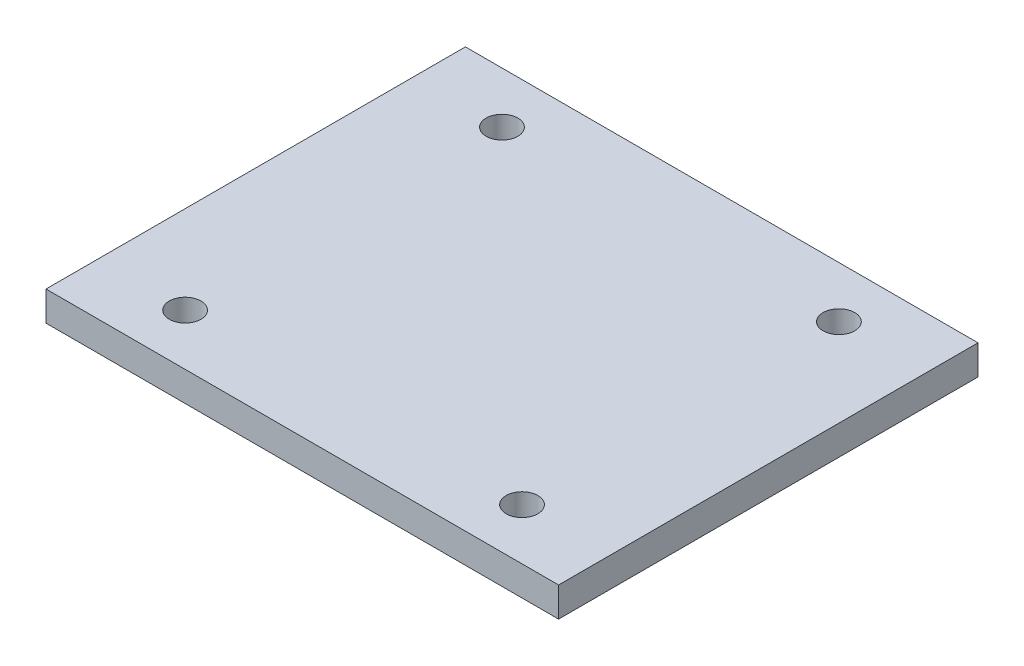
ISO-10303-21;
HEADER;
FILE_DESCRIPTION(('STEP AP214'),'2;1');
FILE_NAME('part.step','',(''),(''),'','','');
FILE_SCHEMA(('AUTOMOTIVE_DESIGN { 1 0 10303 214 1 1 1 1 }'));
ENDSEC;
DATA;
#1=APPLICATION_CONTEXT('core data for automotive mechanical design processes');
#2=APPLICATION_PROTOCOL_DEFINITION('international standard','automotive_design',2000,#1);
#3=PRODUCT_CONTEXT('',#1,'mechanical');
#4=PRODUCT('Part','Part','',(#3));
#5=PRODUCT_RELATED_PRODUCT_CATEGORY('part','',(#4));
#6=PRODUCT_DEFINITION_FORMATION('','',#4);
#7=PRODUCT_DEFINITION_CONTEXT('part definition',#1,'design');
#8=PRODUCT_DEFINITION('design','',#6,#7);
#9=PRODUCT_DEFINITION_SHAPE('','',#8);
#10=(LENGTH_UNIT() NAMED_UNIT(*) SI_UNIT(.MILLI.,.METRE.));
#11=(NAMED_UNIT(*) PLANE_ANGLE_UNIT() SI_UNIT($,.RADIAN.));
#12=(NAMED_UNIT(*) SI_UNIT($,.STERADIAN.) SOLID_ANGLE_UNIT());
#13=UNCERTAINTY_MEASURE_WITH_UNIT(LENGTH_MEASURE(1.E-05),#10,'distance_accuracy_value','');
#14=(GEOMETRIC_REPRESENTATION_CONTEXT(3) GLOBAL_UNCERTAINTY_ASSIGNED_CONTEXT((#13)) GLOBAL_UNIT_ASSIGNED_CONTEXT((#10,
#11,#12)) REPRESENTATION_CONTEXT('',''));
#15=CARTESIAN_POINT('',(0.,0.,0.));
#16=DIRECTION('',(0.,0.,1.));
#17=DIRECTION('',(1.,0.,0.));
#18=AXIS2_PLACEMENT_3D('',#15,#16,#17);
#19=CARTESIAN_POINT('',(110.,6.35,0.));
#20=DIRECTION('',(0.,0.,-1.));
#21=DIRECTION('',(-1.,0.,0.));
#22=AXIS2_PLACEMENT_3D('',#19,#20,#21);
#23=PLANE('',#22);
#24=DIRECTION('',(1.,0.,0.));
#25=VECTOR('',#24,1.);
#26=CARTESIAN_POINT('',(110.,0.,0.));
#27=LINE('',#26,#25);
#28=CARTESIAN_POINT('',(0.,0.,0.));
#29=VERTEX_POINT('',#28);
#30=CARTESIAN_POINT('',(110.,0.,0.));
#31=VERTEX_POINT('',#30);
#32=EDGE_CURVE('E100',#29,#31,#27,.T.);
#33=ORIENTED_EDGE('',*,*,#32,.T.);
#34=DIRECTION('',(0.,-1.,0.));
#35=VECTOR('',#34,1.);
#36=CARTESIAN_POINT('',(110.,6.35,0.));
#37=LINE('',#36,#35);
#38=CARTESIAN_POINT('',(110.,6.35,0.));
#39=VERTEX_POINT('',#38);
#40=EDGE_CURVE('E11',#39,#31,#37,.T.);
#41=ORIENTED_EDGE('',*,*,#40,.F.);
#42=DIRECTION('',(1.,0.,0.));
#43=VECTOR('',#42,1.);
#44=CARTESIAN_POINT('',(110.,6.35,0.));
#45=LINE('',#44,#43);
#46=CARTESIAN_POINT('',(0.,6.35,0.));
#47=VERTEX_POINT('',#46);
#48=EDGE_CURVE('E88',#47,#39,#45,.T.);
#49=ORIENTED_EDGE('',*,*,#48,.F.);
#50=DIRECTION('',(0.,-1.,0.));
#51=VECTOR('',#50,1.);
#52=CARTESIAN_POINT('',(0.,6.35,0.));
#53=LINE('',#52,#51);
#54=EDGE_CURVE('E96',#47,#29,#53,.T.);
#55=ORIENTED_EDGE('',*,*,#54,.T.);
#56=EDGE_LOOP('',(#33,#41,#49,#55));
#57=FACE_BOUND('',#56,.T.);
#58=ADVANCED_FACE('F37',(#57),#23,.F.);
#59=CARTESIAN_POINT('',(110.,6.35,-90.));
#60=DIRECTION('',(-1.,0.,0.));
#61=DIRECTION('',(0.,0.,1.));
#62=AXIS2_PLACEMENT_3D('',#59,#60,#61);
#63=PLANE('',#62);
#64=DIRECTION('',(0.,0.,-1.));
#65=VECTOR('',#64,1.);
#66=CARTESIAN_POINT('',(110.,0.,-90.));
#67=LINE('',#66,#65);
#68=CARTESIAN_POINT('',(110.,0.,-90.));
#69=VERTEX_POINT('',#68);
#70=EDGE_CURVE('E92',#31,#69,#67,.T.);
#71=ORIENTED_EDGE('',*,*,#70,.T.);
#72=DIRECTION('',(0.,-1.,0.));
#73=VECTOR('',#72,1.);
#74=CARTESIAN_POINT('',(110.,6.35,-90.));
#75=LINE('',#74,#73);
#76=CARTESIAN_POINT('',(110.,6.35,-90.));
#77=VERTEX_POINT('',#76);
#78=EDGE_CURVE('E45',#77,#69,#75,.T.);
#79=ORIENTED_EDGE('',*,*,#78,.F.);
#80=DIRECTION('',(0.,0.,-1.));
#81=VECTOR('',#80,1.);
#82=CARTESIAN_POINT('',(110.,6.35,-90.));
#83=LINE('',#82,#81);
#84=EDGE_CURVE('E83',#39,#77,#83,.T.);
#85=ORIENTED_EDGE('',*,*,#84,.F.);
#86=ORIENTED_EDGE('',*,*,#40,.T.);
#87=EDGE_LOOP('',(#71,#79,#85,#86));
#88=FACE_BOUND('',#87,.T.);
#89=ADVANCED_FACE('F91',(#88),#63,.F.);
#90=CARTESIAN_POINT('',(0.,6.35,-90.));
#91=DIRECTION('',(0.,0.,1.));
#92=DIRECTION('',(1.,0.,0.));
#93=AXIS2_PLACEMENT_3D('',#90,#91,#92);
#94=PLANE('',#93);
#95=DIRECTION('',(-1.,0.,0.));
#96=VECTOR('',#95,1.);
#97=CARTESIAN_POINT('',(0.,0.,-90.));
#98=LINE('',#97,#96);
#99=CARTESIAN_POINT('',(0.,0.,-90.));
#100=VERTEX_POINT('',#99);
#101=EDGE_CURVE('E70',#69,#100,#98,.T.);
#102=ORIENTED_EDGE('',*,*,#101,.T.);
#103=DIRECTION('',(0.,-1.,0.));
#104=VECTOR('',#103,1.);
#105=CARTESIAN_POINT('',(0.,6.35,-90.));
#106=LINE('',#105,#104);
#107=CARTESIAN_POINT('',(0.,6.35,-90.));
#108=VERTEX_POINT('',#107);
#109=EDGE_CURVE('E93',#108,#100,#106,.T.);
#110=ORIENTED_EDGE('',*,*,#109,.F.);
#111=DIRECTION('',(-1.,0.,0.));
#112=VECTOR('',#111,1.);
#113=CARTESIAN_POINT('',(0.,6.35,-90.));
#114=LINE('',#113,#112);
#115=EDGE_CURVE('E86',#77,#108,#114,.T.);
#116=ORIENTED_EDGE('',*,*,#115,.F.);
#117=ORIENTED_EDGE('',*,*,#78,.T.);
#118=EDGE_LOOP('',(#102,#110,#116,#117));
#119=FACE_BOUND('',#118,.T.);
#120=ADVANCED_FACE('F94',(#119),#94,.F.);
#121=CARTESIAN_POINT('',(0.,6.35,0.));
#122=DIRECTION('',(1.,0.,0.));
#123=DIRECTION('',(0.,0.,-1.));
#124=AXIS2_PLACEMENT_3D('',#121,#122,#123);
#125=PLANE('',#124);
#126=DIRECTION('',(0.,0.,1.));
#127=VECTOR('',#126,1.);
#128=CARTESIAN_POINT('',(0.,0.,0.));
#129=LINE('',#128,#127);
#130=EDGE_CURVE('E76',#100,#29,#129,.T.);
#131=ORIENTED_EDGE('',*,*,#130,.T.);
#132=ORIENTED_EDGE('',*,*,#54,.F.);
#133=DIRECTION('',(0.,0.,1.));
#134=VECTOR('',#133,1.);
#135=CARTESIAN_POINT('',(0.,6.35,0.));
#136=LINE('',#135,#134);
#137=EDGE_CURVE('E53',#108,#47,#136,.T.);
#138=ORIENTED_EDGE('',*,*,#137,.F.);
#139=ORIENTED_EDGE('',*,*,#109,.T.);
#140=EDGE_LOOP('',(#131,#132,#138,#139));
#141=FACE_BOUND('',#140,.T.);
#142=ADVANCED_FACE('F108',(#141),#125,.F.);
#143=CARTESIAN_POINT('',(0.,6.35,0.));
#144=DIRECTION('',(0.,-1.,0.));
#145=DIRECTION('',(0.,0.,-1.));
#146=AXIS2_PLACEMENT_3D('',#143,#144,#145);
#147=PLANE('',#146);
#148=CARTESIAN_POINT('',(91.1499999999999,6.35,-79.));
#149=DIRECTION('',(0.,1.,0.));
#150=DIRECTION('',(0.,0.,-1.));
#151=AXIS2_PLACEMENT_3D('',#148,#149,#150);
#152=CIRCLE('',#151,3.4);
#153=CARTESIAN_POINT('',(91.1499999999999,6.35,-82.4));
#154=VERTEX_POINT('',#153);
#155=EDGE_CURVE('E123',#154,#154,#152,.T.);
#156=ORIENTED_EDGE('',*,*,#155,.F.);
#157=EDGE_LOOP('',(#156));
#158=FACE_BOUND('',#157,.T.);
#159=CARTESIAN_POINT('',(91.15,6.35,-11.));
#160=DIRECTION('',(0.,1.,0.));
#161=DIRECTION('',(0.,0.,1.));
#162=AXIS2_PLACEMENT_3D('',#159,#160,#161);
#163=CIRCLE('',#162,3.4);
#164=CARTESIAN_POINT('',(91.15,6.35,-7.60000000000002));
#165=VERTEX_POINT('',#164);
#166=EDGE_CURVE('E129',#165,#165,#163,.T.);
#167=ORIENTED_EDGE('',*,*,#166,.F.);
#168=EDGE_LOOP('',(#167));
#169=FACE_BOUND('',#168,.T.);
#170=CARTESIAN_POINT('',(18.85,6.35,-11.));
#171=DIRECTION('',(0.,1.,0.));
#172=DIRECTION('',(0.,0.,-1.));
#173=AXIS2_PLACEMENT_3D('',#170,#171,#172);
#174=CIRCLE('',#173,3.4);
#175=CARTESIAN_POINT('',(18.85,6.35,-14.4));
#176=VERTEX_POINT('',#175);
#177=EDGE_CURVE('E117',#176,#176,#174,.T.);
#178=ORIENTED_EDGE('',*,*,#177,.F.);
#179=EDGE_LOOP('',(#178));
#180=FACE_BOUND('',#179,.T.);
#181=CARTESIAN_POINT('',(18.85,6.35,-79.));
#182=DIRECTION('',(0.,1.,0.));
#183=DIRECTION('',(0.,0.,1.));
#184=AXIS2_PLACEMENT_3D('',#181,#182,#183);
#185=CIRCLE('',#184,3.4);
#186=CARTESIAN_POINT('',(18.85,6.35,-75.6));
#187=VERTEX_POINT('',#186);
#188=EDGE_CURVE('E114',#187,#187,#185,.T.);
#189=ORIENTED_EDGE('',*,*,#188,.F.);
#190=EDGE_LOOP('',(#189));
#191=FACE_BOUND('',#190,.T.);
#192=ORIENTED_EDGE('',*,*,#48,.T.);
#193=ORIENTED_EDGE('',*,*,#84,.T.);
#194=ORIENTED_EDGE('',*,*,#115,.T.);
#195=ORIENTED_EDGE('',*,*,#137,.T.);
#196=EDGE_LOOP('',(#192,#193,#194,#195));
#197=FACE_BOUND('',#196,.T.);
#198=ADVANCED_FACE('F84',(#158,#169,#180,#191,#197),#147,.F.);
#199=CARTESIAN_POINT('',(0.,0.,0.));
#200=DIRECTION('',(0.,-1.,0.));
#201=DIRECTION('',(0.,0.,-1.));
#202=AXIS2_PLACEMENT_3D('',#199,#200,#201);
#203=PLANE('',#202);
#204=CARTESIAN_POINT('',(91.1499999999999,0.,-79.));
#205=DIRECTION('',(0.,1.,0.));
#206=DIRECTION('',(0.,0.,-1.));
#207=AXIS2_PLACEMENT_3D('',#204,#205,#206);
#208=CIRCLE('',#207,3.4);
#209=CARTESIAN_POINT('',(91.1499999999999,0.,-82.4));
#210=VERTEX_POINT('',#209);
#211=EDGE_CURVE('E120',#210,#210,#208,.T.);
#212=ORIENTED_EDGE('',*,*,#211,.T.);
#213=EDGE_LOOP('',(#212));
#214=FACE_BOUND('',#213,.T.);
#215=CARTESIAN_POINT('',(91.15,0.,-11.));
#216=DIRECTION('',(0.,1.,0.));
#217=DIRECTION('',(0.,0.,1.));
#218=AXIS2_PLACEMENT_3D('',#215,#216,#217);
#219=CIRCLE('',#218,3.4);
#220=CARTESIAN_POINT('',(91.15,0.,-7.60000000000002));
#221=VERTEX_POINT('',#220);
#222=EDGE_CURVE('E126',#221,#221,#219,.T.);
#223=ORIENTED_EDGE('',*,*,#222,.T.);
#224=EDGE_LOOP('',(#223));
#225=FACE_BOUND('',#224,.T.);
#226=CARTESIAN_POINT('',(18.85,0.,-11.));
#227=DIRECTION('',(0.,1.,0.));
#228=DIRECTION('',(0.,0.,-1.));
#229=AXIS2_PLACEMENT_3D('',#226,#227,#228);
#230=CIRCLE('',#229,3.4);
#231=CARTESIAN_POINT('',(18.85,0.,-14.4));
#232=VERTEX_POINT('',#231);
#233=EDGE_CURVE('E132',#232,#232,#230,.T.);
#234=ORIENTED_EDGE('',*,*,#233,.T.);
#235=EDGE_LOOP('',(#234));
#236=FACE_BOUND('',#235,.T.);
#237=CARTESIAN_POINT('',(18.85,0.,-79.));
#238=DIRECTION('',(0.,1.,0.));
#239=DIRECTION('',(0.,0.,1.));
#240=AXIS2_PLACEMENT_3D('',#237,#238,#239);
#241=CIRCLE('',#240,3.4);
#242=CARTESIAN_POINT('',(18.85,0.,-75.6));
#243=VERTEX_POINT('',#242);
#244=EDGE_CURVE('E103',#243,#243,#241,.T.);
#245=ORIENTED_EDGE('',*,*,#244,.T.);
#246=EDGE_LOOP('',(#245));
#247=FACE_BOUND('',#246,.T.);
#248=ORIENTED_EDGE('',*,*,#32,.F.);
#249=ORIENTED_EDGE('',*,*,#130,.F.);
#250=ORIENTED_EDGE('',*,*,#101,.F.);
#251=ORIENTED_EDGE('',*,*,#70,.F.);
#252=EDGE_LOOP('',(#248,#249,#250,#251));
#253=FACE_BOUND('',#252,.T.);
#254=ADVANCED_FACE('F111',(#214,#225,#236,#247,#253),#203,.T.);
#255=CARTESIAN_POINT('',(18.85,0.,-79.));
#256=DIRECTION('',(0.,1.,0.));
#257=DIRECTION('',(0.,0.,1.));
#258=AXIS2_PLACEMENT_3D('',#255,#256,#257);
#259=CYLINDRICAL_SURFACE('',#258,3.4);
#260=ORIENTED_EDGE('',*,*,#244,.F.);
#261=EDGE_LOOP('',(#260));
#262=FACE_BOUND('',#261,.T.);
#263=ORIENTED_EDGE('',*,*,#188,.T.);
#264=EDGE_LOOP('',(#263));
#265=FACE_BOUND('',#264,.T.);
#266=ADVANCED_FACE('F146',(#262,#265),#259,.F.);
#267=CARTESIAN_POINT('',(18.85,0.,-11.));
#268=DIRECTION('',(0.,1.,0.));
#269=DIRECTION('',(0.,0.,1.));
#270=AXIS2_PLACEMENT_3D('',#267,#268,#269);
#271=CYLINDRICAL_SURFACE('',#270,3.4);
#272=ORIENTED_EDGE('',*,*,#233,.F.);
#273=EDGE_LOOP('',(#272));
#274=FACE_BOUND('',#273,.T.);
#275=ORIENTED_EDGE('',*,*,#177,.T.);
#276=EDGE_LOOP('',(#275));
#277=FACE_BOUND('',#276,.T.);
#278=ADVANCED_FACE('F138',(#274,#277),#271,.F.);
#279=CARTESIAN_POINT('',(91.15,0.,-11.));
#280=DIRECTION('',(0.,1.,0.));
#281=DIRECTION('',(0.,0.,1.));
#282=AXIS2_PLACEMENT_3D('',#279,#280,#281);
#283=CYLINDRICAL_SURFACE('',#282,3.4);
#284=ORIENTED_EDGE('',*,*,#222,.F.);
#285=EDGE_LOOP('',(#284));
#286=FACE_BOUND('',#285,.T.);
#287=ORIENTED_EDGE('',*,*,#166,.T.);
#288=EDGE_LOOP('',(#287));
#289=FACE_BOUND('',#288,.T.);
#290=ADVANCED_FACE('F154',(#286,#289),#283,.F.);
#291=CARTESIAN_POINT('',(91.1499999999999,0.,-79.));
#292=DIRECTION('',(0.,1.,0.));
#293=DIRECTION('',(0.,0.,1.));
#294=AXIS2_PLACEMENT_3D('',#291,#292,#293);
#295=CYLINDRICAL_SURFACE('',#294,3.4);
#296=ORIENTED_EDGE('',*,*,#211,.F.);
#297=EDGE_LOOP('',(#296));
#298=FACE_BOUND('',#297,.T.);
#299=ORIENTED_EDGE('',*,*,#155,.T.);
#300=EDGE_LOOP('',(#299));
#301=FACE_BOUND('',#300,.T.);
#302=ADVANCED_FACE('F205',(#298,#301),#295,.F.);
#303=CLOSED_SHELL('',(#58,#89,#120,#142,#198,#254,#266,#278,#290,#302));
#304=MANIFOLD_SOLID_BREP('B2',#303);
#305=ADVANCED_BREP_SHAPE_REPRESENTATION('',(#18,#304),#14);
#306=SHAPE_DEFINITION_REPRESENTATION(#9,#305);
ENDSEC;
END-ISO-10303-21;
